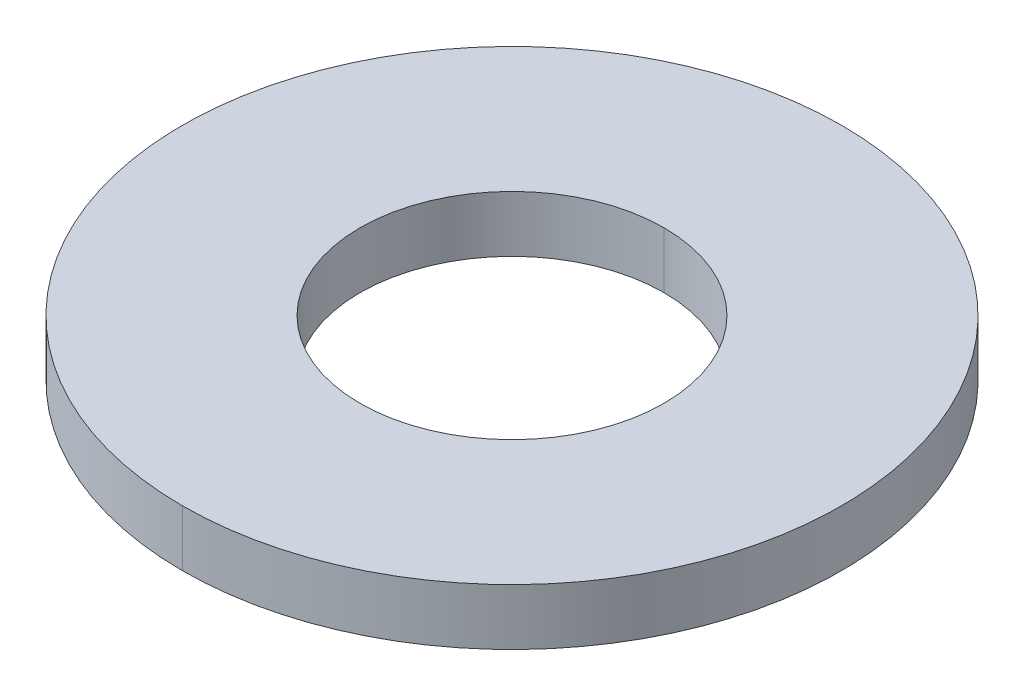
ISO-10303-21;
HEADER;
FILE_DESCRIPTION(('STEP AP214'),'2;1');
FILE_NAME('part.step','',(''),(''),'','','');
FILE_SCHEMA(('AUTOMOTIVE_DESIGN { 1 0 10303 214 1 1 1 1 }'));
ENDSEC;
DATA;
#1=APPLICATION_CONTEXT('core data for automotive mechanical design processes');
#2=APPLICATION_PROTOCOL_DEFINITION('international standard','automotive_design',2000,#1);
#3=PRODUCT_CONTEXT('',#1,'mechanical');
#4=PRODUCT('Part','Part','',(#3));
#5=PRODUCT_RELATED_PRODUCT_CATEGORY('part','',(#4));
#6=PRODUCT_DEFINITION_FORMATION('','',#4);
#7=PRODUCT_DEFINITION_CONTEXT('part definition',#1,'design');
#8=PRODUCT_DEFINITION('design','',#6,#7);
#9=PRODUCT_DEFINITION_SHAPE('','',#8);
#10=(LENGTH_UNIT() NAMED_UNIT(*) SI_UNIT(.MILLI.,.METRE.));
#11=(NAMED_UNIT(*) PLANE_ANGLE_UNIT() SI_UNIT($,.RADIAN.));
#12=(NAMED_UNIT(*) SI_UNIT($,.STERADIAN.) SOLID_ANGLE_UNIT());
#13=UNCERTAINTY_MEASURE_WITH_UNIT(LENGTH_MEASURE(1.E-05),#10,'distance_accuracy_value','');
#14=(GEOMETRIC_REPRESENTATION_CONTEXT(3) GLOBAL_UNCERTAINTY_ASSIGNED_CONTEXT((#13)) GLOBAL_UNIT_ASSIGNED_CONTEXT((#10,
#11,#12)) REPRESENTATION_CONTEXT('',''));
#15=CARTESIAN_POINT('',(0.,0.,0.));
#16=DIRECTION('',(0.,0.,1.));
#17=DIRECTION('',(1.,0.,0.));
#18=AXIS2_PLACEMENT_3D('',#15,#16,#17);
#19=CARTESIAN_POINT('',(0.,0.,0.));
#20=DIRECTION('',(0.,1.,0.));
#21=DIRECTION('',(1.,0.,0.));
#22=AXIS2_PLACEMENT_3D('',#19,#20,#21);
#23=PLANE('',#22);
#24=CARTESIAN_POINT('',(0.,0.,0.));
#25=DIRECTION('',(0.,1.,0.));
#26=DIRECTION('',(0.,0.,1.));
#27=AXIS2_PLACEMENT_3D('',#24,#25,#26);
#28=CIRCLE('',#27,4.7625);
#29=CARTESIAN_POINT('',(0.,0.,-4.7625));
#30=VERTEX_POINT('',#29);
#31=CARTESIAN_POINT('',(0.,0.,4.7625));
#32=VERTEX_POINT('',#31);
#33=EDGE_CURVE('E87',#30,#32,#28,.T.);
#34=ORIENTED_EDGE('',*,*,#33,.F.);
#35=CARTESIAN_POINT('',(0.,0.,0.));
#36=DIRECTION('',(0.,1.,0.));
#37=DIRECTION('',(0.,0.,1.));
#38=AXIS2_PLACEMENT_3D('',#35,#36,#37);
#39=CIRCLE('',#38,4.7625);
#40=EDGE_CURVE('E37',#32,#30,#39,.T.);
#41=ORIENTED_EDGE('',*,*,#40,.F.);
#42=EDGE_LOOP('',(#34,#41));
#43=FACE_BOUND('',#42,.T.);
#44=CARTESIAN_POINT('',(0.,0.,0.));
#45=DIRECTION('',(0.,1.,0.));
#46=DIRECTION('',(0.,0.,1.));
#47=AXIS2_PLACEMENT_3D('',#44,#45,#46);
#48=CIRCLE('',#47,2.1971);
#49=CARTESIAN_POINT('',(0.,0.,-2.1971));
#50=VERTEX_POINT('',#49);
#51=CARTESIAN_POINT('',(0.,0.,2.1971));
#52=VERTEX_POINT('',#51);
#53=EDGE_CURVE('E10',#50,#52,#48,.T.);
#54=ORIENTED_EDGE('',*,*,#53,.T.);
#55=CARTESIAN_POINT('',(0.,0.,0.));
#56=DIRECTION('',(0.,1.,0.));
#57=DIRECTION('',(0.,0.,1.));
#58=AXIS2_PLACEMENT_3D('',#55,#56,#57);
#59=CIRCLE('',#58,2.1971);
#60=EDGE_CURVE('E27',#52,#50,#59,.T.);
#61=ORIENTED_EDGE('',*,*,#60,.T.);
#62=EDGE_LOOP('',(#54,#61));
#63=FACE_BOUND('',#62,.T.);
#64=ADVANCED_FACE('F16',(#43,#63),#23,.F.);
#65=CARTESIAN_POINT('',(0.,0.8128,0.));
#66=DIRECTION('',(0.,-1.,0.));
#67=DIRECTION('',(0.,0.,-1.));
#68=AXIS2_PLACEMENT_3D('',#65,#66,#67);
#69=CYLINDRICAL_SURFACE('',#68,2.1971);
#70=CARTESIAN_POINT('',(0.,0.8128,0.));
#71=DIRECTION('',(0.,1.,0.));
#72=DIRECTION('',(0.,0.,1.));
#73=AXIS2_PLACEMENT_3D('',#70,#71,#72);
#74=CIRCLE('',#73,2.1971);
#75=CARTESIAN_POINT('',(0.,0.8128,-2.1971));
#76=VERTEX_POINT('',#75);
#77=CARTESIAN_POINT('',(0.,0.8128,2.1971));
#78=VERTEX_POINT('',#77);
#79=EDGE_CURVE('E108',#76,#78,#74,.T.);
#80=ORIENTED_EDGE('',*,*,#79,.T.);
#81=DIRECTION('',(0.,-1.,0.));
#82=VECTOR('',#81,1.);
#83=CARTESIAN_POINT('',(0.,0.8128,2.1971));
#84=LINE('',#83,#82);
#85=EDGE_CURVE('E104',#78,#52,#84,.T.);
#86=ORIENTED_EDGE('',*,*,#85,.T.);
#87=ORIENTED_EDGE('',*,*,#53,.F.);
#88=DIRECTION('',(0.,-1.,0.));
#89=VECTOR('',#88,1.);
#90=CARTESIAN_POINT('',(0.,0.8128,-2.1971));
#91=LINE('',#90,#89);
#92=EDGE_CURVE('E83',#76,#50,#91,.T.);
#93=ORIENTED_EDGE('',*,*,#92,.F.);
#94=EDGE_LOOP('',(#80,#86,#87,#93));
#95=FACE_BOUND('',#94,.T.);
#96=ADVANCED_FACE('F125',(#95),#69,.F.);
#97=CARTESIAN_POINT('',(0.,0.8128,0.));
#98=DIRECTION('',(0.,-1.,0.));
#99=DIRECTION('',(0.,0.,-1.));
#100=AXIS2_PLACEMENT_3D('',#97,#98,#99);
#101=CYLINDRICAL_SURFACE('',#100,4.7625);
#102=DIRECTION('',(0.,-1.,0.));
#103=VECTOR('',#102,1.);
#104=CARTESIAN_POINT('',(0.,0.8128,4.7625));
#105=LINE('',#104,#103);
#106=CARTESIAN_POINT('',(0.,0.8128,4.7625));
#107=VERTEX_POINT('',#106);
#108=EDGE_CURVE('E84',#107,#32,#105,.T.);
#109=ORIENTED_EDGE('',*,*,#108,.F.);
#110=CARTESIAN_POINT('',(0.,0.8128,0.));
#111=DIRECTION('',(0.,1.,0.));
#112=DIRECTION('',(0.,0.,1.));
#113=AXIS2_PLACEMENT_3D('',#110,#111,#112);
#114=CIRCLE('',#113,4.7625);
#115=CARTESIAN_POINT('',(0.,0.8128,-4.7625));
#116=VERTEX_POINT('',#115);
#117=EDGE_CURVE('E73',#116,#107,#114,.T.);
#118=ORIENTED_EDGE('',*,*,#117,.F.);
#119=DIRECTION('',(0.,-1.,0.));
#120=VECTOR('',#119,1.);
#121=CARTESIAN_POINT('',(0.,0.8128,-4.7625));
#122=LINE('',#121,#120);
#123=EDGE_CURVE('E20',#116,#30,#122,.T.);
#124=ORIENTED_EDGE('',*,*,#123,.T.);
#125=ORIENTED_EDGE('',*,*,#33,.T.);
#126=EDGE_LOOP('',(#109,#118,#124,#125));
#127=FACE_BOUND('',#126,.T.);
#128=ADVANCED_FACE('F88',(#127),#101,.T.);
#129=CARTESIAN_POINT('',(0.,0.8128,0.));
#130=DIRECTION('',(0.,-1.,0.));
#131=DIRECTION('',(0.,0.,-1.));
#132=AXIS2_PLACEMENT_3D('',#129,#130,#131);
#133=CYLINDRICAL_SURFACE('',#132,4.7625);
#134=CARTESIAN_POINT('',(0.,0.8128,0.));
#135=DIRECTION('',(0.,1.,0.));
#136=DIRECTION('',(0.,0.,1.));
#137=AXIS2_PLACEMENT_3D('',#134,#135,#136);
#138=CIRCLE('',#137,4.7625);
#139=EDGE_CURVE('E81',#107,#116,#138,.T.);
#140=ORIENTED_EDGE('',*,*,#139,.F.);
#141=ORIENTED_EDGE('',*,*,#108,.T.);
#142=ORIENTED_EDGE('',*,*,#40,.T.);
#143=ORIENTED_EDGE('',*,*,#123,.F.);
#144=EDGE_LOOP('',(#140,#141,#142,#143));
#145=FACE_BOUND('',#144,.T.);
#146=ADVANCED_FACE('F89',(#145),#133,.T.);
#147=CARTESIAN_POINT('',(0.,0.8128,0.));
#148=DIRECTION('',(0.,-1.,0.));
#149=DIRECTION('',(0.,0.,-1.));
#150=AXIS2_PLACEMENT_3D('',#147,#148,#149);
#151=CYLINDRICAL_SURFACE('',#150,2.1971);
#152=ORIENTED_EDGE('',*,*,#85,.F.);
#153=CARTESIAN_POINT('',(0.,0.8128,0.));
#154=DIRECTION('',(0.,1.,0.));
#155=DIRECTION('',(0.,0.,1.));
#156=AXIS2_PLACEMENT_3D('',#153,#154,#155);
#157=CIRCLE('',#156,2.1971);
#158=EDGE_CURVE('E97',#78,#76,#157,.T.);
#159=ORIENTED_EDGE('',*,*,#158,.T.);
#160=ORIENTED_EDGE('',*,*,#92,.T.);
#161=ORIENTED_EDGE('',*,*,#60,.F.);
#162=EDGE_LOOP('',(#152,#159,#160,#161));
#163=FACE_BOUND('',#162,.T.);
#164=ADVANCED_FACE('F118',(#163),#151,.F.);
#165=CARTESIAN_POINT('',(0.,0.8128,0.));
#166=DIRECTION('',(0.,1.,0.));
#167=DIRECTION('',(1.,0.,0.));
#168=AXIS2_PLACEMENT_3D('',#165,#166,#167);
#169=PLANE('',#168);
#170=ORIENTED_EDGE('',*,*,#117,.T.);
#171=ORIENTED_EDGE('',*,*,#139,.T.);
#172=EDGE_LOOP('',(#170,#171));
#173=FACE_BOUND('',#172,.T.);
#174=ORIENTED_EDGE('',*,*,#79,.F.);
#175=ORIENTED_EDGE('',*,*,#158,.F.);
#176=EDGE_LOOP('',(#174,#175));
#177=FACE_BOUND('',#176,.T.);
#178=ADVANCED_FACE('F18',(#173,#177),#169,.T.);
#179=CLOSED_SHELL('',(#64,#96,#128,#146,#164,#178));
#180=MANIFOLD_SOLID_BREP('B1',#179);
#181=ADVANCED_BREP_SHAPE_REPRESENTATION('',(#18,#180),#14);
#182=SHAPE_DEFINITION_REPRESENTATION(#9,#181);
ENDSEC;
END-ISO-10303-21;
